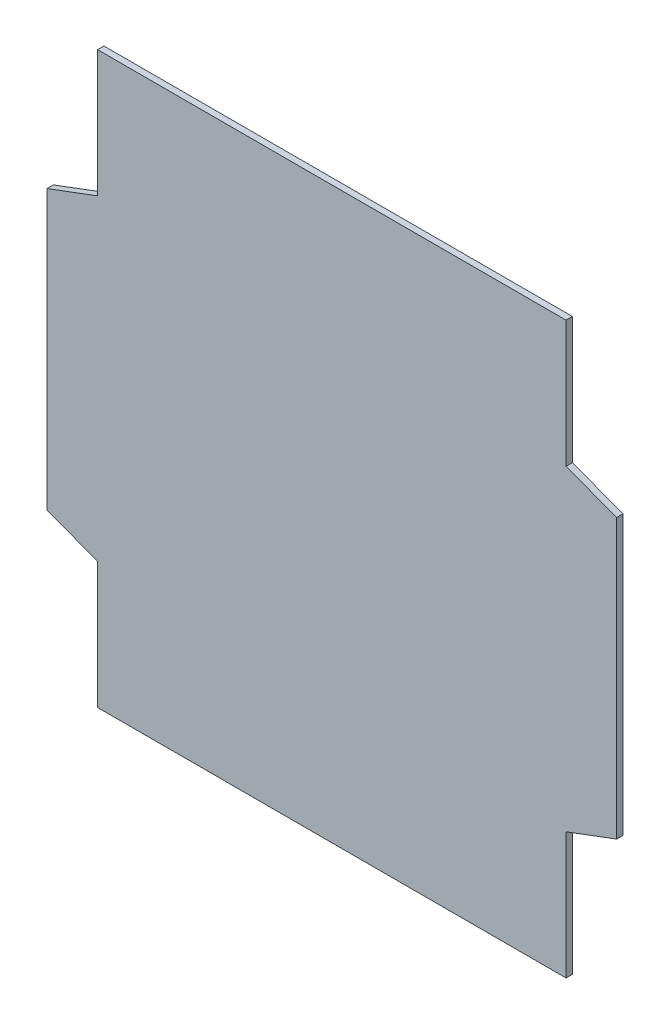
ISO-10303-21;
HEADER;
FILE_DESCRIPTION(('STEP AP214'),'2;1');
FILE_NAME('part.step','',(''),(''),'','','');
FILE_SCHEMA(('AUTOMOTIVE_DESIGN { 1 0 10303 214 1 1 1 1 }'));
ENDSEC;
DATA;
#1=APPLICATION_CONTEXT('core data for automotive mechanical design processes');
#2=APPLICATION_PROTOCOL_DEFINITION('international standard','automotive_design',2000,#1);
#3=PRODUCT_CONTEXT('',#1,'mechanical');
#4=PRODUCT('Part','Part','',(#3));
#5=PRODUCT_RELATED_PRODUCT_CATEGORY('part','',(#4));
#6=PRODUCT_DEFINITION_FORMATION('','',#4);
#7=PRODUCT_DEFINITION_CONTEXT('part definition',#1,'design');
#8=PRODUCT_DEFINITION('design','',#6,#7);
#9=PRODUCT_DEFINITION_SHAPE('','',#8);
#10=(LENGTH_UNIT() NAMED_UNIT(*) SI_UNIT(.MILLI.,.METRE.));
#11=(NAMED_UNIT(*) PLANE_ANGLE_UNIT() SI_UNIT($,.RADIAN.));
#12=(NAMED_UNIT(*) SI_UNIT($,.STERADIAN.) SOLID_ANGLE_UNIT());
#13=UNCERTAINTY_MEASURE_WITH_UNIT(LENGTH_MEASURE(1.E-05),#10,'distance_accuracy_value','');
#14=(GEOMETRIC_REPRESENTATION_CONTEXT(3) GLOBAL_UNCERTAINTY_ASSIGNED_CONTEXT((#13)) GLOBAL_UNIT_ASSIGNED_CONTEXT((#10,
#11,#12)) REPRESENTATION_CONTEXT('',''));
#15=CARTESIAN_POINT('',(0.,0.,0.));
#16=DIRECTION('',(0.,0.,1.));
#17=DIRECTION('',(1.,0.,0.));
#18=AXIS2_PLACEMENT_3D('',#15,#16,#17);
#19=CARTESIAN_POINT('',(0.,0.,0.));
#20=DIRECTION('',(0.,0.,1.));
#21=DIRECTION('',(1.,0.,0.));
#22=AXIS2_PLACEMENT_3D('',#19,#20,#21);
#23=PLANE('',#22);
#24=DIRECTION('',(1.,0.,0.));
#25=VECTOR('',#24,1.);
#26=CARTESIAN_POINT('',(1.85,-2.25,0.));
#27=LINE('',#26,#25);
#28=CARTESIAN_POINT('',(-1.85,-2.25,0.));
#29=VERTEX_POINT('',#28);
#30=CARTESIAN_POINT('',(1.85,-2.25,0.));
#31=VERTEX_POINT('',#30);
#32=EDGE_CURVE('E103',#29,#31,#27,.T.);
#33=ORIENTED_EDGE('',*,*,#32,.F.);
#34=DIRECTION('',(0.,1.,0.));
#35=VECTOR('',#34,1.);
#36=CARTESIAN_POINT('',(-1.85,0.,0.));
#37=LINE('',#36,#35);
#38=CARTESIAN_POINT('',(-1.85,-1.25,0.));
#39=VERTEX_POINT('',#38);
#40=EDGE_CURVE('E112',#39,#29,#37,.F.);
#41=ORIENTED_EDGE('',*,*,#40,.F.);
#42=DIRECTION('',(0.936329177569052,-0.351123441588372,0.));
#43=VECTOR('',#42,1.);
#44=CARTESIAN_POINT('',(-2.24999999999999,-1.10000000000001,0.));
#45=LINE('',#44,#43);
#46=CARTESIAN_POINT('',(-2.25,-1.10000000000001,0.));
#47=VERTEX_POINT('',#46);
#48=EDGE_CURVE('E19',#47,#39,#45,.T.);
#49=ORIENTED_EDGE('',*,*,#48,.F.);
#50=DIRECTION('',(0.,1.,0.));
#51=VECTOR('',#50,1.);
#52=CARTESIAN_POINT('',(-2.24999999999999,-1.10000000000001,0.));
#53=LINE('',#52,#51);
#54=CARTESIAN_POINT('',(-2.25,1.1,0.));
#55=VERTEX_POINT('',#54);
#56=EDGE_CURVE('E164',#55,#47,#53,.F.);
#57=ORIENTED_EDGE('',*,*,#56,.F.);
#58=DIRECTION('',(-0.936329177569044,-0.351123441588392,0.));
#59=VECTOR('',#58,1.);
#60=CARTESIAN_POINT('',(-2.25,1.1,0.));
#61=LINE('',#60,#59);
#62=CARTESIAN_POINT('',(-1.85,1.25,0.));
#63=VERTEX_POINT('',#62);
#64=EDGE_CURVE('E159',#63,#55,#61,.T.);
#65=ORIENTED_EDGE('',*,*,#64,.F.);
#66=DIRECTION('',(0.,1.,0.));
#67=VECTOR('',#66,1.);
#68=CARTESIAN_POINT('',(-1.85,1.25,0.));
#69=LINE('',#68,#67);
#70=CARTESIAN_POINT('',(-1.85,2.25,0.));
#71=VERTEX_POINT('',#70);
#72=EDGE_CURVE('E154',#71,#63,#69,.F.);
#73=ORIENTED_EDGE('',*,*,#72,.F.);
#74=DIRECTION('',(1.,0.,0.));
#75=VECTOR('',#74,1.);
#76=CARTESIAN_POINT('',(-1.85,2.25,0.));
#77=LINE('',#76,#75);
#78=CARTESIAN_POINT('',(1.85,2.25,0.));
#79=VERTEX_POINT('',#78);
#80=EDGE_CURVE('E149',#79,#71,#77,.F.);
#81=ORIENTED_EDGE('',*,*,#80,.F.);
#82=DIRECTION('',(0.,1.,0.));
#83=VECTOR('',#82,1.);
#84=CARTESIAN_POINT('',(1.85,2.25,0.));
#85=LINE('',#84,#83);
#86=CARTESIAN_POINT('',(1.85,1.25,0.));
#87=VERTEX_POINT('',#86);
#88=EDGE_CURVE('E144',#87,#79,#85,.T.);
#89=ORIENTED_EDGE('',*,*,#88,.F.);
#90=DIRECTION('',(-0.936329177569052,0.351123441588373,0.));
#91=VECTOR('',#90,1.);
#92=CARTESIAN_POINT('',(1.85,1.25,0.));
#93=LINE('',#92,#91);
#94=CARTESIAN_POINT('',(2.25,1.10000000000001,0.));
#95=VERTEX_POINT('',#94);
#96=EDGE_CURVE('E139',#95,#87,#93,.T.);
#97=ORIENTED_EDGE('',*,*,#96,.F.);
#98=DIRECTION('',(0.,1.,0.));
#99=VECTOR('',#98,1.);
#100=CARTESIAN_POINT('',(2.25,1.10000000000001,0.));
#101=LINE('',#100,#99);
#102=CARTESIAN_POINT('',(2.25,-1.1,0.));
#103=VERTEX_POINT('',#102);
#104=EDGE_CURVE('E134',#103,#95,#101,.T.);
#105=ORIENTED_EDGE('',*,*,#104,.F.);
#106=DIRECTION('',(0.936329177569045,0.351123441588389,0.));
#107=VECTOR('',#106,1.);
#108=CARTESIAN_POINT('',(2.25,-1.1,0.));
#109=LINE('',#108,#107);
#110=CARTESIAN_POINT('',(1.85,-1.25,0.));
#111=VERTEX_POINT('',#110);
#112=EDGE_CURVE('E129',#111,#103,#109,.T.);
#113=ORIENTED_EDGE('',*,*,#112,.F.);
#114=DIRECTION('',(0.,1.,0.));
#115=VECTOR('',#114,1.);
#116=CARTESIAN_POINT('',(1.85,-1.25,0.));
#117=LINE('',#116,#115);
#118=EDGE_CURVE('E124',#31,#111,#117,.T.);
#119=ORIENTED_EDGE('',*,*,#118,.F.);
#120=EDGE_LOOP('',(#33,#41,#49,#57,#65,#73,#81,#89,#97,#105,#113,#119));
#121=FACE_BOUND('',#120,.T.);
#122=ADVANCED_FACE('F16',(#121),#23,.F.);
#123=CARTESIAN_POINT('',(1.85,-2.25,0.));
#124=DIRECTION('',(0.,-1.,0.));
#125=DIRECTION('',(0.,0.,-1.));
#126=AXIS2_PLACEMENT_3D('',#123,#124,#125);
#127=PLANE('',#126);
#128=ORIENTED_EDGE('',*,*,#32,.T.);
#129=DIRECTION('',(0.,0.,-1.));
#130=VECTOR('',#129,1.);
#131=CARTESIAN_POINT('',(1.85,-2.25,0.));
#132=LINE('',#131,#130);
#133=CARTESIAN_POINT('',(1.85,-2.25,0.05));
#134=VERTEX_POINT('',#133);
#135=EDGE_CURVE('E119',#134,#31,#132,.T.);
#136=ORIENTED_EDGE('',*,*,#135,.F.);
#137=DIRECTION('',(1.,0.,0.));
#138=VECTOR('',#137,1.);
#139=CARTESIAN_POINT('',(0.,-2.25,0.05));
#140=LINE('',#139,#138);
#141=CARTESIAN_POINT('',(-1.85,-2.25,0.05));
#142=VERTEX_POINT('',#141);
#143=EDGE_CURVE('E168',#142,#134,#140,.T.);
#144=ORIENTED_EDGE('',*,*,#143,.F.);
#145=DIRECTION('',(0.,0.,1.));
#146=VECTOR('',#145,1.);
#147=CARTESIAN_POINT('',(-1.85,-2.25,0.));
#148=LINE('',#147,#146);
#149=EDGE_CURVE('E117',#29,#142,#148,.T.);
#150=ORIENTED_EDGE('',*,*,#149,.F.);
#151=EDGE_LOOP('',(#128,#136,#144,#150));
#152=FACE_BOUND('',#151,.T.);
#153=ADVANCED_FACE('F234',(#152),#127,.T.);
#154=CARTESIAN_POINT('',(1.85,-1.25,0.));
#155=DIRECTION('',(1.,0.,0.));
#156=DIRECTION('',(0.,0.,-1.));
#157=AXIS2_PLACEMENT_3D('',#154,#155,#156);
#158=PLANE('',#157);
#159=ORIENTED_EDGE('',*,*,#118,.T.);
#160=DIRECTION('',(0.,0.,1.));
#161=VECTOR('',#160,1.);
#162=CARTESIAN_POINT('',(1.85,-1.25,0.));
#163=LINE('',#162,#161);
#164=CARTESIAN_POINT('',(1.85,-1.25,0.05));
#165=VERTEX_POINT('',#164);
#166=EDGE_CURVE('E126',#165,#111,#163,.F.);
#167=ORIENTED_EDGE('',*,*,#166,.F.);
#168=DIRECTION('',(0.,1.,0.));
#169=VECTOR('',#168,1.);
#170=CARTESIAN_POINT('',(1.85,0.,0.05));
#171=LINE('',#170,#169);
#172=EDGE_CURVE('E171',#134,#165,#171,.T.);
#173=ORIENTED_EDGE('',*,*,#172,.F.);
#174=ORIENTED_EDGE('',*,*,#135,.T.);
#175=EDGE_LOOP('',(#159,#167,#173,#174));
#176=FACE_BOUND('',#175,.T.);
#177=ADVANCED_FACE('F233',(#176),#158,.T.);
#178=CARTESIAN_POINT('',(2.25,-1.1,0.));
#179=DIRECTION('',(0.351123441588389,-0.936329177569045,0.));
#180=DIRECTION('',(0.936329177569045,0.351123441588389,0.));
#181=AXIS2_PLACEMENT_3D('',#178,#179,#180);
#182=PLANE('',#181);
#183=ORIENTED_EDGE('',*,*,#112,.T.);
#184=DIRECTION('',(0.,0.,-1.));
#185=VECTOR('',#184,1.);
#186=CARTESIAN_POINT('',(2.25,-1.1,0.));
#187=LINE('',#186,#185);
#188=CARTESIAN_POINT('',(2.25,-1.1,0.05));
#189=VERTEX_POINT('',#188);
#190=EDGE_CURVE('E131',#189,#103,#187,.T.);
#191=ORIENTED_EDGE('',*,*,#190,.F.);
#192=DIRECTION('',(0.936329177569045,0.351123441588389,0.));
#193=VECTOR('',#192,1.);
#194=CARTESIAN_POINT('',(1.85,-1.25,0.05));
#195=LINE('',#194,#193);
#196=EDGE_CURVE('E174',#165,#189,#195,.T.);
#197=ORIENTED_EDGE('',*,*,#196,.F.);
#198=ORIENTED_EDGE('',*,*,#166,.T.);
#199=EDGE_LOOP('',(#183,#191,#197,#198));
#200=FACE_BOUND('',#199,.T.);
#201=ADVANCED_FACE('F230',(#200),#182,.T.);
#202=CARTESIAN_POINT('',(2.25,1.10000000000001,0.));
#203=DIRECTION('',(1.,0.,0.));
#204=DIRECTION('',(0.,0.,-1.));
#205=AXIS2_PLACEMENT_3D('',#202,#203,#204);
#206=PLANE('',#205);
#207=ORIENTED_EDGE('',*,*,#104,.T.);
#208=DIRECTION('',(0.,0.,1.));
#209=VECTOR('',#208,1.);
#210=CARTESIAN_POINT('',(2.25,1.10000000000001,0.));
#211=LINE('',#210,#209);
#212=CARTESIAN_POINT('',(2.25,1.10000000000001,0.05));
#213=VERTEX_POINT('',#212);
#214=EDGE_CURVE('E136',#213,#95,#211,.F.);
#215=ORIENTED_EDGE('',*,*,#214,.F.);
#216=DIRECTION('',(0.,1.,0.));
#217=VECTOR('',#216,1.);
#218=CARTESIAN_POINT('',(2.25,0.,0.05));
#219=LINE('',#218,#217);
#220=EDGE_CURVE('E177',#189,#213,#219,.T.);
#221=ORIENTED_EDGE('',*,*,#220,.F.);
#222=ORIENTED_EDGE('',*,*,#190,.T.);
#223=EDGE_LOOP('',(#207,#215,#221,#222));
#224=FACE_BOUND('',#223,.T.);
#225=ADVANCED_FACE('F226',(#224),#206,.T.);
#226=CARTESIAN_POINT('',(1.85,1.25,0.));
#227=DIRECTION('',(0.351123441588373,0.936329177569052,0.));
#228=DIRECTION('',(-0.936329177569052,0.351123441588373,0.));
#229=AXIS2_PLACEMENT_3D('',#226,#227,#228);
#230=PLANE('',#229);
#231=ORIENTED_EDGE('',*,*,#96,.T.);
#232=DIRECTION('',(0.,0.,-1.));
#233=VECTOR('',#232,1.);
#234=CARTESIAN_POINT('',(1.85,1.25,0.));
#235=LINE('',#234,#233);
#236=CARTESIAN_POINT('',(1.85,1.25,0.05));
#237=VERTEX_POINT('',#236);
#238=EDGE_CURVE('E141',#237,#87,#235,.T.);
#239=ORIENTED_EDGE('',*,*,#238,.F.);
#240=DIRECTION('',(-0.936329177569052,0.351123441588372,0.));
#241=VECTOR('',#240,1.);
#242=CARTESIAN_POINT('',(2.25,1.10000000000001,0.05));
#243=LINE('',#242,#241);
#244=EDGE_CURVE('E180',#213,#237,#243,.T.);
#245=ORIENTED_EDGE('',*,*,#244,.F.);
#246=ORIENTED_EDGE('',*,*,#214,.T.);
#247=EDGE_LOOP('',(#231,#239,#245,#246));
#248=FACE_BOUND('',#247,.T.);
#249=ADVANCED_FACE('F223',(#248),#230,.T.);
#250=CARTESIAN_POINT('',(1.85,2.25,0.));
#251=DIRECTION('',(1.,0.,0.));
#252=DIRECTION('',(0.,0.,-1.));
#253=AXIS2_PLACEMENT_3D('',#250,#251,#252);
#254=PLANE('',#253);
#255=ORIENTED_EDGE('',*,*,#88,.T.);
#256=DIRECTION('',(0.,0.,1.));
#257=VECTOR('',#256,1.);
#258=CARTESIAN_POINT('',(1.85,2.25,0.));
#259=LINE('',#258,#257);
#260=CARTESIAN_POINT('',(1.85,2.25,0.05));
#261=VERTEX_POINT('',#260);
#262=EDGE_CURVE('E146',#261,#79,#259,.F.);
#263=ORIENTED_EDGE('',*,*,#262,.F.);
#264=DIRECTION('',(0.,1.,0.));
#265=VECTOR('',#264,1.);
#266=CARTESIAN_POINT('',(1.85,0.,0.05));
#267=LINE('',#266,#265);
#268=EDGE_CURVE('E183',#237,#261,#267,.T.);
#269=ORIENTED_EDGE('',*,*,#268,.F.);
#270=ORIENTED_EDGE('',*,*,#238,.T.);
#271=EDGE_LOOP('',(#255,#263,#269,#270));
#272=FACE_BOUND('',#271,.T.);
#273=ADVANCED_FACE('F220',(#272),#254,.T.);
#274=CARTESIAN_POINT('',(-1.85,2.25,0.));
#275=DIRECTION('',(0.,1.,0.));
#276=DIRECTION('',(0.,0.,1.));
#277=AXIS2_PLACEMENT_3D('',#274,#275,#276);
#278=PLANE('',#277);
#279=ORIENTED_EDGE('',*,*,#80,.T.);
#280=DIRECTION('',(0.,0.,1.));
#281=VECTOR('',#280,1.);
#282=CARTESIAN_POINT('',(-1.85,2.25,0.));
#283=LINE('',#282,#281);
#284=CARTESIAN_POINT('',(-1.85,2.25,0.05));
#285=VERTEX_POINT('',#284);
#286=EDGE_CURVE('E151',#285,#71,#283,.F.);
#287=ORIENTED_EDGE('',*,*,#286,.F.);
#288=DIRECTION('',(1.,0.,0.));
#289=VECTOR('',#288,1.);
#290=CARTESIAN_POINT('',(0.,2.25,0.05));
#291=LINE('',#290,#289);
#292=EDGE_CURVE('E186',#261,#285,#291,.F.);
#293=ORIENTED_EDGE('',*,*,#292,.F.);
#294=ORIENTED_EDGE('',*,*,#262,.T.);
#295=EDGE_LOOP('',(#279,#287,#293,#294));
#296=FACE_BOUND('',#295,.T.);
#297=ADVANCED_FACE('F214',(#296),#278,.T.);
#298=CARTESIAN_POINT('',(-1.85,1.25,0.));
#299=DIRECTION('',(-1.,0.,0.));
#300=DIRECTION('',(0.,0.,1.));
#301=AXIS2_PLACEMENT_3D('',#298,#299,#300);
#302=PLANE('',#301);
#303=ORIENTED_EDGE('',*,*,#72,.T.);
#304=DIRECTION('',(0.,0.,1.));
#305=VECTOR('',#304,1.);
#306=CARTESIAN_POINT('',(-1.85,1.25,0.));
#307=LINE('',#306,#305);
#308=CARTESIAN_POINT('',(-1.85,1.25,0.05));
#309=VERTEX_POINT('',#308);
#310=EDGE_CURVE('E156',#309,#63,#307,.F.);
#311=ORIENTED_EDGE('',*,*,#310,.F.);
#312=DIRECTION('',(0.,1.,0.));
#313=VECTOR('',#312,1.);
#314=CARTESIAN_POINT('',(-1.85,0.,0.05));
#315=LINE('',#314,#313);
#316=EDGE_CURVE('E189',#285,#309,#315,.F.);
#317=ORIENTED_EDGE('',*,*,#316,.F.);
#318=ORIENTED_EDGE('',*,*,#286,.T.);
#319=EDGE_LOOP('',(#303,#311,#317,#318));
#320=FACE_BOUND('',#319,.T.);
#321=ADVANCED_FACE('F211',(#320),#302,.T.);
#322=CARTESIAN_POINT('',(-2.25,1.1,0.));
#323=DIRECTION('',(-0.351123441588392,0.936329177569044,0.));
#324=DIRECTION('',(-0.936329177569044,-0.351123441588392,0.));
#325=AXIS2_PLACEMENT_3D('',#322,#323,#324);
#326=PLANE('',#325);
#327=ORIENTED_EDGE('',*,*,#64,.T.);
#328=DIRECTION('',(0.,0.,1.));
#329=VECTOR('',#328,1.);
#330=CARTESIAN_POINT('',(-2.24999999999999,1.1,0.));
#331=LINE('',#330,#329);
#332=CARTESIAN_POINT('',(-2.25,1.1,0.05));
#333=VERTEX_POINT('',#332);
#334=EDGE_CURVE('E161',#333,#55,#331,.F.);
#335=ORIENTED_EDGE('',*,*,#334,.F.);
#336=DIRECTION('',(-0.936329177569045,-0.351123441588391,0.));
#337=VECTOR('',#336,1.);
#338=CARTESIAN_POINT('',(-1.85,1.25,0.05));
#339=LINE('',#338,#337);
#340=EDGE_CURVE('E192',#309,#333,#339,.T.);
#341=ORIENTED_EDGE('',*,*,#340,.F.);
#342=ORIENTED_EDGE('',*,*,#310,.T.);
#343=EDGE_LOOP('',(#327,#335,#341,#342));
#344=FACE_BOUND('',#343,.T.);
#345=ADVANCED_FACE('F208',(#344),#326,.T.);
#346=CARTESIAN_POINT('',(-2.24999999999999,-1.10000000000001,0.));
#347=DIRECTION('',(-1.,0.,0.));
#348=DIRECTION('',(0.,0.,1.));
#349=AXIS2_PLACEMENT_3D('',#346,#347,#348);
#350=PLANE('',#349);
#351=ORIENTED_EDGE('',*,*,#56,.T.);
#352=DIRECTION('',(0.,0.,1.));
#353=VECTOR('',#352,1.);
#354=CARTESIAN_POINT('',(-2.24999999999999,-1.10000000000001,0.));
#355=LINE('',#354,#353);
#356=CARTESIAN_POINT('',(-2.25,-1.10000000000001,0.05));
#357=VERTEX_POINT('',#356);
#358=EDGE_CURVE('E107',#357,#47,#355,.F.);
#359=ORIENTED_EDGE('',*,*,#358,.F.);
#360=DIRECTION('',(0.,1.,0.));
#361=VECTOR('',#360,1.);
#362=CARTESIAN_POINT('',(-2.25,0.,0.05));
#363=LINE('',#362,#361);
#364=EDGE_CURVE('E195',#333,#357,#363,.F.);
#365=ORIENTED_EDGE('',*,*,#364,.F.);
#366=ORIENTED_EDGE('',*,*,#334,.T.);
#367=EDGE_LOOP('',(#351,#359,#365,#366));
#368=FACE_BOUND('',#367,.T.);
#369=ADVANCED_FACE('F203',(#368),#350,.T.);
#370=CARTESIAN_POINT('',(-1.85,-1.25,0.));
#371=DIRECTION('',(-0.351123441588373,-0.936329177569052,0.));
#372=DIRECTION('',(0.936329177569052,-0.351123441588373,0.));
#373=AXIS2_PLACEMENT_3D('',#370,#371,#372);
#374=PLANE('',#373);
#375=ORIENTED_EDGE('',*,*,#48,.T.);
#376=DIRECTION('',(0.,0.,1.));
#377=VECTOR('',#376,1.);
#378=CARTESIAN_POINT('',(-1.85,-1.25,0.));
#379=LINE('',#378,#377);
#380=CARTESIAN_POINT('',(-1.85,-1.25,0.05));
#381=VERTEX_POINT('',#380);
#382=EDGE_CURVE('E34',#381,#39,#379,.F.);
#383=ORIENTED_EDGE('',*,*,#382,.F.);
#384=DIRECTION('',(0.936329177569052,-0.351123441588372,0.));
#385=VECTOR('',#384,1.);
#386=CARTESIAN_POINT('',(-2.24999999999999,-1.10000000000001,0.05));
#387=LINE('',#386,#385);
#388=EDGE_CURVE('E25',#357,#381,#387,.T.);
#389=ORIENTED_EDGE('',*,*,#388,.F.);
#390=ORIENTED_EDGE('',*,*,#358,.T.);
#391=EDGE_LOOP('',(#375,#383,#389,#390));
#392=FACE_BOUND('',#391,.T.);
#393=ADVANCED_FACE('F106',(#392),#374,.T.);
#394=CARTESIAN_POINT('',(-1.85,-2.25,0.));
#395=DIRECTION('',(-1.,0.,0.));
#396=DIRECTION('',(0.,0.,1.));
#397=AXIS2_PLACEMENT_3D('',#394,#395,#396);
#398=PLANE('',#397);
#399=ORIENTED_EDGE('',*,*,#40,.T.);
#400=ORIENTED_EDGE('',*,*,#149,.T.);
#401=DIRECTION('',(0.,1.,0.));
#402=VECTOR('',#401,1.);
#403=CARTESIAN_POINT('',(-1.85,0.,0.05));
#404=LINE('',#403,#402);
#405=EDGE_CURVE('E11',#381,#142,#404,.F.);
#406=ORIENTED_EDGE('',*,*,#405,.F.);
#407=ORIENTED_EDGE('',*,*,#382,.T.);
#408=EDGE_LOOP('',(#399,#400,#406,#407));
#409=FACE_BOUND('',#408,.T.);
#410=ADVANCED_FACE('F114',(#409),#398,.T.);
#411=CARTESIAN_POINT('',(0.,0.,0.05));
#412=DIRECTION('',(0.,0.,1.));
#413=DIRECTION('',(1.,0.,0.));
#414=AXIS2_PLACEMENT_3D('',#411,#412,#413);
#415=PLANE('',#414);
#416=ORIENTED_EDGE('',*,*,#388,.T.);
#417=ORIENTED_EDGE('',*,*,#405,.T.);
#418=ORIENTED_EDGE('',*,*,#143,.T.);
#419=ORIENTED_EDGE('',*,*,#172,.T.);
#420=ORIENTED_EDGE('',*,*,#196,.T.);
#421=ORIENTED_EDGE('',*,*,#220,.T.);
#422=ORIENTED_EDGE('',*,*,#244,.T.);
#423=ORIENTED_EDGE('',*,*,#268,.T.);
#424=ORIENTED_EDGE('',*,*,#292,.T.);
#425=ORIENTED_EDGE('',*,*,#316,.T.);
#426=ORIENTED_EDGE('',*,*,#340,.T.);
#427=ORIENTED_EDGE('',*,*,#364,.T.);
#428=EDGE_LOOP('',(#416,#417,#418,#419,#420,#421,#422,#423,#424,#425,#426,#427));
#429=FACE_BOUND('',#428,.T.);
#430=ADVANCED_FACE('F199',(#429),#415,.T.);
#431=CLOSED_SHELL('',(#122,#153,#177,#201,#225,#249,#273,#297,#321,#345,#369,#393,#410,#430));
#432=MANIFOLD_SOLID_BREP('B1',#431);
#433=ADVANCED_BREP_SHAPE_REPRESENTATION('',(#18,#432),#14);
#434=SHAPE_DEFINITION_REPRESENTATION(#9,#433);
ENDSEC;
END-ISO-10303-21;
